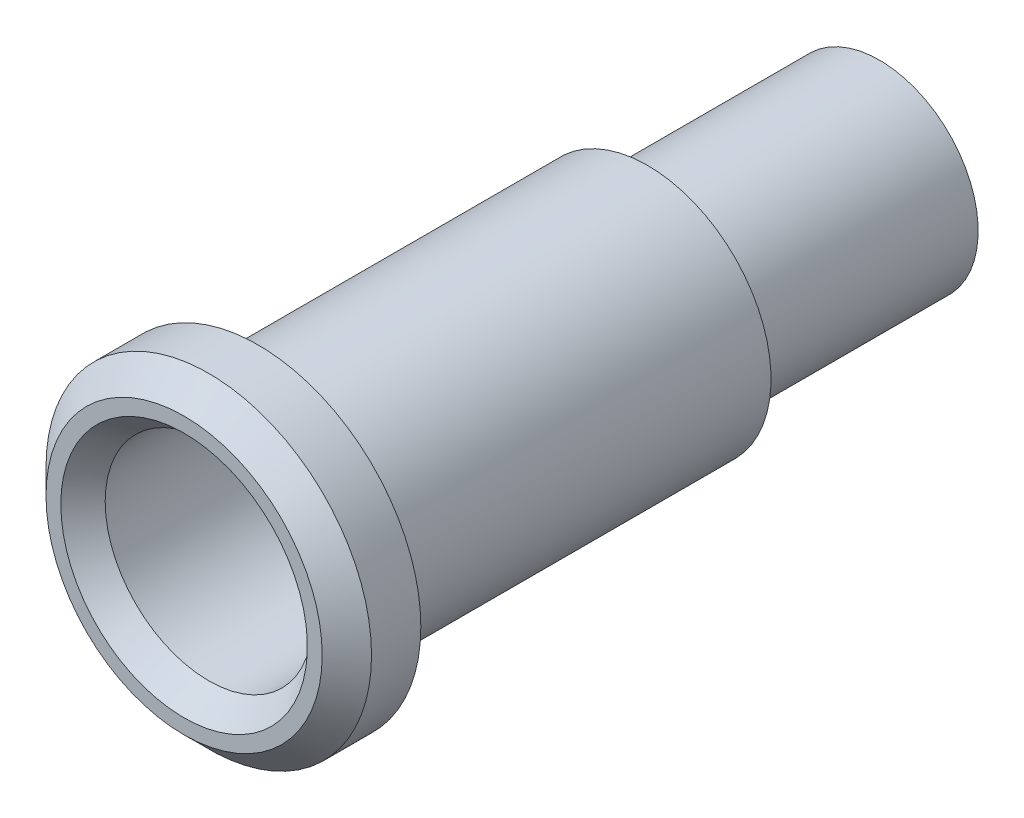
ISO-10303-21;
HEADER;
FILE_DESCRIPTION(('STEP AP214'),'2;1');
FILE_NAME('part.step','',(''),(''),'','','');
FILE_SCHEMA(('AUTOMOTIVE_DESIGN { 1 0 10303 214 1 1 1 1 }'));
ENDSEC;
DATA;
#1=APPLICATION_CONTEXT('core data for automotive mechanical design processes');
#2=APPLICATION_PROTOCOL_DEFINITION('international standard','automotive_design',2000,#1);
#3=PRODUCT_CONTEXT('',#1,'mechanical');
#4=PRODUCT('Part','Part','',(#3));
#5=PRODUCT_RELATED_PRODUCT_CATEGORY('part','',(#4));
#6=PRODUCT_DEFINITION_FORMATION('','',#4);
#7=PRODUCT_DEFINITION_CONTEXT('part definition',#1,'design');
#8=PRODUCT_DEFINITION('design','',#6,#7);
#9=PRODUCT_DEFINITION_SHAPE('','',#8);
#10=(LENGTH_UNIT() NAMED_UNIT(*) SI_UNIT(.MILLI.,.METRE.));
#11=(NAMED_UNIT(*) PLANE_ANGLE_UNIT() SI_UNIT($,.RADIAN.));
#12=(NAMED_UNIT(*) SI_UNIT($,.STERADIAN.) SOLID_ANGLE_UNIT());
#13=UNCERTAINTY_MEASURE_WITH_UNIT(LENGTH_MEASURE(1.E-05),#10,'distance_accuracy_value','');
#14=(GEOMETRIC_REPRESENTATION_CONTEXT(3) GLOBAL_UNCERTAINTY_ASSIGNED_CONTEXT((#13)) GLOBAL_UNIT_ASSIGNED_CONTEXT((#10,
#11,#12)) REPRESENTATION_CONTEXT('',''));
#15=CARTESIAN_POINT('',(0.,0.,0.));
#16=DIRECTION('',(0.,0.,1.));
#17=DIRECTION('',(1.,0.,0.));
#18=AXIS2_PLACEMENT_3D('',#15,#16,#17);
#19=CARTESIAN_POINT('',(0.,0.,1.50000000024875));
#20=DIRECTION('',(0.,0.,-1.));
#21=DIRECTION('',(-1.,0.,0.));
#22=AXIS2_PLACEMENT_3D('',#19,#20,#21);
#23=CYLINDRICAL_SURFACE('',#22,2.1);
#24=CARTESIAN_POINT('',(0.,0.,-6.9));
#25=DIRECTION('',(0.,0.,-1.));
#26=DIRECTION('',(-1.,0.,0.));
#27=AXIS2_PLACEMENT_3D('',#24,#25,#26);
#28=CIRCLE('',#27,2.1);
#29=CARTESIAN_POINT('',(-2.1,0.,-6.9));
#30=VERTEX_POINT('',#29);
#31=EDGE_CURVE('E76',#30,#30,#28,.T.);
#32=ORIENTED_EDGE('',*,*,#31,.T.);
#33=EDGE_LOOP('',(#32));
#34=FACE_BOUND('',#33,.T.);
#35=CARTESIAN_POINT('',(0.,0.,0.99999999991951));
#36=DIRECTION('',(0.,0.,-1.));
#37=DIRECTION('',(-1.,0.,0.));
#38=AXIS2_PLACEMENT_3D('',#35,#36,#37);
#39=CIRCLE('',#38,2.1);
#40=CARTESIAN_POINT('',(-2.1,0.,0.99999999991951));
#41=VERTEX_POINT('',#40);
#42=EDGE_CURVE('E10',#41,#41,#39,.T.);
#43=ORIENTED_EDGE('',*,*,#42,.F.);
#44=EDGE_LOOP('',(#43));
#45=FACE_BOUND('',#44,.T.);
#46=ADVANCED_FACE('F30',(#34,#45),#23,.F.);
#47=CARTESIAN_POINT('',(0.,0.,1.50000000024875));
#48=DIRECTION('',(0.,0.,1.));
#49=DIRECTION('',(1.,0.,0.));
#50=AXIS2_PLACEMENT_3D('',#47,#48,#49);
#51=CONICAL_SURFACE('',#50,2.49999999960401,0.674740941419426);
#52=ORIENTED_EDGE('',*,*,#42,.T.);
#53=EDGE_LOOP('',(#52));
#54=FACE_BOUND('',#53,.T.);
#55=CARTESIAN_POINT('',(0.,0.,1.50000000024875));
#56=DIRECTION('',(0.,0.,-1.));
#57=DIRECTION('',(-1.,0.,0.));
#58=AXIS2_PLACEMENT_3D('',#55,#56,#57);
#59=CIRCLE('',#58,2.49999999960401);
#60=CARTESIAN_POINT('',(-2.49999999960401,0.,1.50000000024875));
#61=VERTEX_POINT('',#60);
#62=EDGE_CURVE('E36',#61,#61,#59,.T.);
#63=ORIENTED_EDGE('',*,*,#62,.F.);
#64=EDGE_LOOP('',(#63));
#65=FACE_BOUND('',#64,.T.);
#66=ADVANCED_FACE('F94',(#54,#65),#51,.F.);
#67=CARTESIAN_POINT('',(2.80000000004029,0.,1.50000000024875));
#68=DIRECTION('',(0.,0.,1.));
#69=DIRECTION('',(1.,0.,0.));
#70=AXIS2_PLACEMENT_3D('',#67,#68,#69);
#71=PLANE('',#70);
#72=ORIENTED_EDGE('',*,*,#62,.T.);
#73=EDGE_LOOP('',(#72));
#74=FACE_BOUND('',#73,.T.);
#75=CARTESIAN_POINT('',(0.,0.,1.50000000024875));
#76=DIRECTION('',(0.,0.,-1.));
#77=DIRECTION('',(-1.,0.,0.));
#78=AXIS2_PLACEMENT_3D('',#75,#76,#77);
#79=CIRCLE('',#78,2.80000000004029);
#80=CARTESIAN_POINT('',(-2.80000000004029,0.,1.50000000024875));
#81=VERTEX_POINT('',#80);
#82=EDGE_CURVE('E40',#81,#81,#79,.T.);
#83=ORIENTED_EDGE('',*,*,#82,.F.);
#84=EDGE_LOOP('',(#83));
#85=FACE_BOUND('',#84,.T.);
#86=ADVANCED_FACE('F98',(#74,#85),#71,.T.);
#87=CARTESIAN_POINT('',(0.,0.,1.00000000022769));
#88=DIRECTION('',(0.,0.,-1.));
#89=DIRECTION('',(-1.,0.,0.));
#90=AXIS2_PLACEMENT_3D('',#87,#88,#89);
#91=CONICAL_SURFACE('',#90,3.30000000006135,0.785398163397449);
#92=ORIENTED_EDGE('',*,*,#82,.T.);
#93=EDGE_LOOP('',(#92));
#94=FACE_BOUND('',#93,.T.);
#95=CARTESIAN_POINT('',(0.,0.,1.00000000022769));
#96=DIRECTION('',(0.,0.,-1.));
#97=DIRECTION('',(-1.,0.,0.));
#98=AXIS2_PLACEMENT_3D('',#95,#96,#97);
#99=CIRCLE('',#98,3.30000000006135);
#100=CARTESIAN_POINT('',(-3.30000000006135,0.,1.00000000022769));
#101=VERTEX_POINT('',#100);
#102=EDGE_CURVE('E44',#101,#101,#99,.T.);
#103=ORIENTED_EDGE('',*,*,#102,.F.);
#104=EDGE_LOOP('',(#103));
#105=FACE_BOUND('',#104,.T.);
#106=ADVANCED_FACE('F102',(#94,#105),#91,.T.);
#107=CARTESIAN_POINT('',(0.,0.,1.50000000024875));
#108=DIRECTION('',(0.,0.,-1.));
#109=DIRECTION('',(-1.,0.,0.));
#110=AXIS2_PLACEMENT_3D('',#107,#108,#109);
#111=CYLINDRICAL_SURFACE('',#110,3.30000000006135);
#112=ORIENTED_EDGE('',*,*,#102,.T.);
#113=EDGE_LOOP('',(#112));
#114=FACE_BOUND('',#113,.T.);
#115=CARTESIAN_POINT('',(0.,0.,0.));
#116=DIRECTION('',(0.,0.,-1.));
#117=DIRECTION('',(-1.,0.,0.));
#118=AXIS2_PLACEMENT_3D('',#115,#116,#117);
#119=CIRCLE('',#118,3.30000000006135);
#120=CARTESIAN_POINT('',(-3.30000000006135,0.,0.));
#121=VERTEX_POINT('',#120);
#122=EDGE_CURVE('E49',#121,#121,#119,.T.);
#123=ORIENTED_EDGE('',*,*,#122,.F.);
#124=EDGE_LOOP('',(#123));
#125=FACE_BOUND('',#124,.T.);
#126=ADVANCED_FACE('F108',(#114,#125),#111,.T.);
#127=CARTESIAN_POINT('',(2.5,0.,0.));
#128=DIRECTION('',(0.,0.,-1.));
#129=DIRECTION('',(-1.,0.,0.));
#130=AXIS2_PLACEMENT_3D('',#127,#128,#129);
#131=PLANE('',#130);
#132=ORIENTED_EDGE('',*,*,#122,.T.);
#133=EDGE_LOOP('',(#132));
#134=FACE_BOUND('',#133,.T.);
#135=CARTESIAN_POINT('',(0.,0.,0.));
#136=DIRECTION('',(0.,0.,-1.));
#137=DIRECTION('',(-1.,0.,0.));
#138=AXIS2_PLACEMENT_3D('',#135,#136,#137);
#139=CIRCLE('',#138,2.5);
#140=CARTESIAN_POINT('',(-2.5,0.,0.));
#141=VERTEX_POINT('',#140);
#142=EDGE_CURVE('E52',#141,#141,#139,.T.);
#143=ORIENTED_EDGE('',*,*,#142,.F.);
#144=EDGE_LOOP('',(#143));
#145=FACE_BOUND('',#144,.T.);
#146=ADVANCED_FACE('F112',(#134,#145),#131,.T.);
#147=CARTESIAN_POINT('',(0.,0.,1.50000000024875));
#148=DIRECTION('',(0.,0.,-1.));
#149=DIRECTION('',(-1.,0.,0.));
#150=AXIS2_PLACEMENT_3D('',#147,#148,#149);
#151=CYLINDRICAL_SURFACE('',#150,2.5);
#152=ORIENTED_EDGE('',*,*,#142,.T.);
#153=EDGE_LOOP('',(#152));
#154=FACE_BOUND('',#153,.T.);
#155=CARTESIAN_POINT('',(0.,0.,-7.9));
#156=DIRECTION('',(0.,0.,-1.));
#157=DIRECTION('',(-1.,0.,0.));
#158=AXIS2_PLACEMENT_3D('',#155,#156,#157);
#159=CIRCLE('',#158,2.5);
#160=CARTESIAN_POINT('',(-2.5,0.,-7.9));
#161=VERTEX_POINT('',#160);
#162=EDGE_CURVE('E55',#161,#161,#159,.T.);
#163=ORIENTED_EDGE('',*,*,#162,.F.);
#164=EDGE_LOOP('',(#163));
#165=FACE_BOUND('',#164,.T.);
#166=ADVANCED_FACE('F116',(#154,#165),#151,.T.);
#167=CARTESIAN_POINT('',(2.,0.,-7.9));
#168=DIRECTION('',(0.,0.,-1.));
#169=DIRECTION('',(-1.,0.,0.));
#170=AXIS2_PLACEMENT_3D('',#167,#168,#169);
#171=PLANE('',#170);
#172=ORIENTED_EDGE('',*,*,#162,.T.);
#173=EDGE_LOOP('',(#172));
#174=FACE_BOUND('',#173,.T.);
#175=CARTESIAN_POINT('',(0.,0.,-7.9));
#176=DIRECTION('',(0.,0.,-1.));
#177=DIRECTION('',(-1.,0.,0.));
#178=AXIS2_PLACEMENT_3D('',#175,#176,#177);
#179=CIRCLE('',#178,2.);
#180=CARTESIAN_POINT('',(-2.,0.,-7.9));
#181=VERTEX_POINT('',#180);
#182=EDGE_CURVE('E58',#181,#181,#179,.T.);
#183=ORIENTED_EDGE('',*,*,#182,.F.);
#184=EDGE_LOOP('',(#183));
#185=FACE_BOUND('',#184,.T.);
#186=ADVANCED_FACE('F120',(#174,#185),#171,.T.);
#187=CARTESIAN_POINT('',(0.,0.,1.50000000024875));
#188=DIRECTION('',(0.,0.,-1.));
#189=DIRECTION('',(-1.,0.,0.));
#190=AXIS2_PLACEMENT_3D('',#187,#188,#189);
#191=CYLINDRICAL_SURFACE('',#190,2.);
#192=ORIENTED_EDGE('',*,*,#182,.T.);
#193=EDGE_LOOP('',(#192));
#194=FACE_BOUND('',#193,.T.);
#195=CARTESIAN_POINT('',(0.,0.,-12.6));
#196=DIRECTION('',(0.,0.,-1.));
#197=DIRECTION('',(-1.,0.,0.));
#198=AXIS2_PLACEMENT_3D('',#195,#196,#197);
#199=CIRCLE('',#198,2.);
#200=CARTESIAN_POINT('',(-2.,0.,-12.6));
#201=VERTEX_POINT('',#200);
#202=EDGE_CURVE('E61',#201,#201,#199,.T.);
#203=ORIENTED_EDGE('',*,*,#202,.F.);
#204=EDGE_LOOP('',(#203));
#205=FACE_BOUND('',#204,.T.);
#206=ADVANCED_FACE('F124',(#194,#205),#191,.T.);
#207=CARTESIAN_POINT('',(1.,0.,-12.6));
#208=DIRECTION('',(0.,0.,-1.));
#209=DIRECTION('',(-1.,0.,0.));
#210=AXIS2_PLACEMENT_3D('',#207,#208,#209);
#211=PLANE('',#210);
#212=ORIENTED_EDGE('',*,*,#202,.T.);
#213=EDGE_LOOP('',(#212));
#214=FACE_BOUND('',#213,.T.);
#215=CARTESIAN_POINT('',(0.,0.,-12.6));
#216=DIRECTION('',(0.,0.,-1.));
#217=DIRECTION('',(-1.,0.,0.));
#218=AXIS2_PLACEMENT_3D('',#215,#216,#217);
#219=CIRCLE('',#218,1.);
#220=CARTESIAN_POINT('',(-1.,0.,-12.6));
#221=VERTEX_POINT('',#220);
#222=EDGE_CURVE('E64',#221,#221,#219,.T.);
#223=ORIENTED_EDGE('',*,*,#222,.F.);
#224=EDGE_LOOP('',(#223));
#225=FACE_BOUND('',#224,.T.);
#226=ADVANCED_FACE('F128',(#214,#225),#211,.T.);
#227=CARTESIAN_POINT('',(0.,0.,1.50000000024875));
#228=DIRECTION('',(0.,0.,-1.));
#229=DIRECTION('',(-1.,0.,0.));
#230=AXIS2_PLACEMENT_3D('',#227,#228,#229);
#231=CYLINDRICAL_SURFACE('',#230,1.);
#232=ORIENTED_EDGE('',*,*,#222,.T.);
#233=EDGE_LOOP('',(#232));
#234=FACE_BOUND('',#233,.T.);
#235=CARTESIAN_POINT('',(0.,0.,-7.9));
#236=DIRECTION('',(0.,0.,-1.));
#237=DIRECTION('',(-1.,0.,0.));
#238=AXIS2_PLACEMENT_3D('',#235,#236,#237);
#239=CIRCLE('',#238,1.);
#240=CARTESIAN_POINT('',(-1.,0.,-7.9));
#241=VERTEX_POINT('',#240);
#242=EDGE_CURVE('E67',#241,#241,#239,.T.);
#243=ORIENTED_EDGE('',*,*,#242,.F.);
#244=EDGE_LOOP('',(#243));
#245=FACE_BOUND('',#244,.T.);
#246=ADVANCED_FACE('F132',(#234,#245),#231,.F.);
#247=CARTESIAN_POINT('',(1.425,0.,-7.9));
#248=DIRECTION('',(0.,0.,1.));
#249=DIRECTION('',(1.,0.,0.));
#250=AXIS2_PLACEMENT_3D('',#247,#248,#249);
#251=PLANE('',#250);
#252=ORIENTED_EDGE('',*,*,#242,.T.);
#253=EDGE_LOOP('',(#252));
#254=FACE_BOUND('',#253,.T.);
#255=CARTESIAN_POINT('',(0.,0.,-7.9));
#256=DIRECTION('',(0.,0.,-1.));
#257=DIRECTION('',(-1.,0.,0.));
#258=AXIS2_PLACEMENT_3D('',#255,#256,#257);
#259=CIRCLE('',#258,1.425);
#260=CARTESIAN_POINT('',(-1.425,0.,-7.9));
#261=VERTEX_POINT('',#260);
#262=EDGE_CURVE('E70',#261,#261,#259,.T.);
#263=ORIENTED_EDGE('',*,*,#262,.F.);
#264=EDGE_LOOP('',(#263));
#265=FACE_BOUND('',#264,.T.);
#266=ADVANCED_FACE('F90',(#254,#265),#251,.T.);
#267=CARTESIAN_POINT('',(0.,0.,1.50000000024875));
#268=DIRECTION('',(0.,0.,-1.));
#269=DIRECTION('',(-1.,0.,0.));
#270=AXIS2_PLACEMENT_3D('',#267,#268,#269);
#271=CYLINDRICAL_SURFACE('',#270,1.425);
#272=ORIENTED_EDGE('',*,*,#262,.T.);
#273=EDGE_LOOP('',(#272));
#274=FACE_BOUND('',#273,.T.);
#275=CARTESIAN_POINT('',(0.,0.,-6.9));
#276=DIRECTION('',(0.,0.,-1.));
#277=DIRECTION('',(-1.,0.,0.));
#278=AXIS2_PLACEMENT_3D('',#275,#276,#277);
#279=CIRCLE('',#278,1.425);
#280=CARTESIAN_POINT('',(-1.425,0.,-6.9));
#281=VERTEX_POINT('',#280);
#282=EDGE_CURVE('E73',#281,#281,#279,.T.);
#283=ORIENTED_EDGE('',*,*,#282,.F.);
#284=EDGE_LOOP('',(#283));
#285=FACE_BOUND('',#284,.T.);
#286=ADVANCED_FACE('F84',(#274,#285),#271,.F.);
#287=CARTESIAN_POINT('',(2.1,0.,-6.9));
#288=DIRECTION('',(0.,0.,1.));
#289=DIRECTION('',(1.,0.,0.));
#290=AXIS2_PLACEMENT_3D('',#287,#288,#289);
#291=PLANE('',#290);
#292=ORIENTED_EDGE('',*,*,#282,.T.);
#293=EDGE_LOOP('',(#292));
#294=FACE_BOUND('',#293,.T.);
#295=ORIENTED_EDGE('',*,*,#31,.F.);
#296=EDGE_LOOP('',(#295));
#297=FACE_BOUND('',#296,.T.);
#298=ADVANCED_FACE('F82',(#294,#297),#291,.T.);
#299=CLOSED_SHELL('',(#46,#66,#86,#106,#126,#146,#166,#186,#206,#226,#246,#266,#286,#298));
#300=MANIFOLD_SOLID_BREP('B2',#299);
#301=ADVANCED_BREP_SHAPE_REPRESENTATION('',(#18,#300),#14);
#302=SHAPE_DEFINITION_REPRESENTATION(#9,#301);
ENDSEC;
END-ISO-10303-21;
